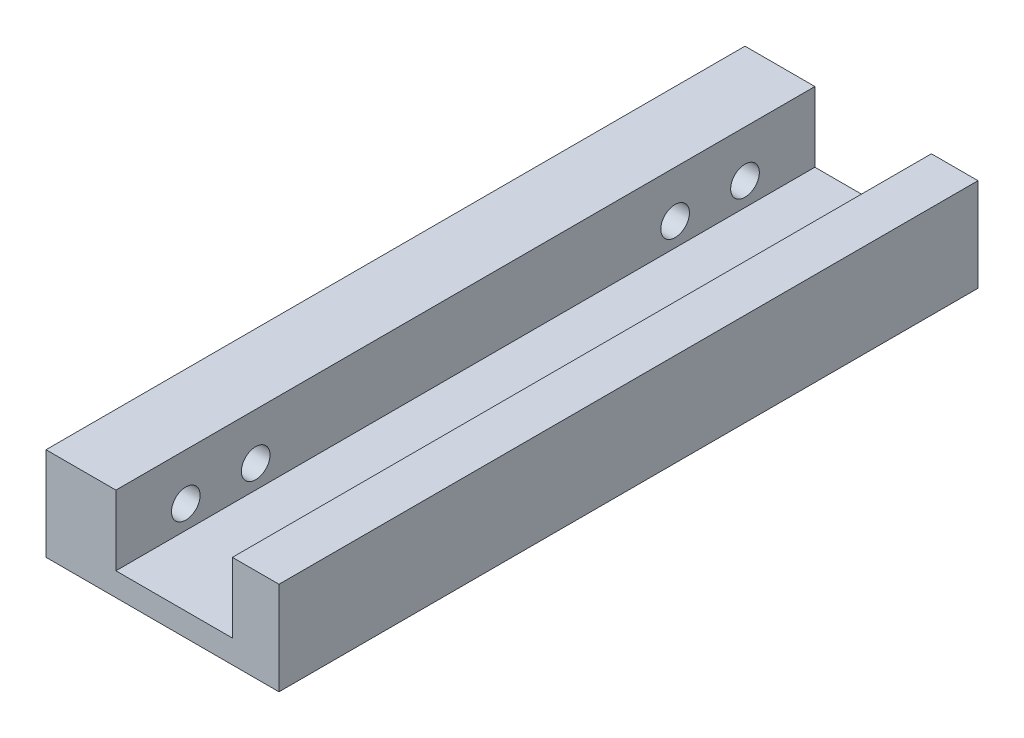
ISO-10303-21;
HEADER;
FILE_DESCRIPTION(('STEP AP214'),'2;1');
FILE_NAME('part.step','',(''),(''),'','','');
FILE_SCHEMA(('AUTOMOTIVE_DESIGN { 1 0 10303 214 1 1 1 1 }'));
ENDSEC;
DATA;
#1=APPLICATION_CONTEXT('core data for automotive mechanical design processes');
#2=APPLICATION_PROTOCOL_DEFINITION('international standard','automotive_design',2000,#1);
#3=PRODUCT_CONTEXT('',#1,'mechanical');
#4=PRODUCT('Part','Part','',(#3));
#5=PRODUCT_RELATED_PRODUCT_CATEGORY('part','',(#4));
#6=PRODUCT_DEFINITION_FORMATION('','',#4);
#7=PRODUCT_DEFINITION_CONTEXT('part definition',#1,'design');
#8=PRODUCT_DEFINITION('design','',#6,#7);
#9=PRODUCT_DEFINITION_SHAPE('','',#8);
#10=(LENGTH_UNIT() NAMED_UNIT(*) SI_UNIT(.MILLI.,.METRE.));
#11=(NAMED_UNIT(*) PLANE_ANGLE_UNIT() SI_UNIT($,.RADIAN.));
#12=(NAMED_UNIT(*) SI_UNIT($,.STERADIAN.) SOLID_ANGLE_UNIT());
#13=UNCERTAINTY_MEASURE_WITH_UNIT(LENGTH_MEASURE(1.E-05),#10,'distance_accuracy_value','');
#14=(GEOMETRIC_REPRESENTATION_CONTEXT(3) GLOBAL_UNCERTAINTY_ASSIGNED_CONTEXT((#13)) GLOBAL_UNIT_ASSIGNED_CONTEXT((#10,
#11,#12)) REPRESENTATION_CONTEXT('',''));
#15=CARTESIAN_POINT('',(0.,0.,0.));
#16=DIRECTION('',(0.,0.,1.));
#17=DIRECTION('',(1.,0.,0.));
#18=AXIS2_PLACEMENT_3D('',#15,#16,#17);
#19=CARTESIAN_POINT('',(0.,-4.,30.));
#20=DIRECTION('',(1.,0.,0.));
#21=DIRECTION('',(0.,0.,-1.));
#22=AXIS2_PLACEMENT_3D('',#19,#20,#21);
#23=PLANE('',#22);
#24=CARTESIAN_POINT('',(0.,-2.,27.));
#25=DIRECTION('',(-1.,0.,0.));
#26=DIRECTION('',(0.,0.,1.));
#27=AXIS2_PLACEMENT_3D('',#24,#25,#26);
#28=CIRCLE('',#27,0.615000000000002);
#29=CARTESIAN_POINT('',(0.,-2.,27.615));
#30=VERTEX_POINT('',#29);
#31=EDGE_CURVE('E197',#30,#30,#28,.T.);
#32=ORIENTED_EDGE('',*,*,#31,.F.);
#33=EDGE_LOOP('',(#32));
#34=FACE_BOUND('',#33,.T.);
#35=CARTESIAN_POINT('',(0.,-2.,24.));
#36=DIRECTION('',(-1.,0.,0.));
#37=DIRECTION('',(0.,0.,1.));
#38=AXIS2_PLACEMENT_3D('',#35,#36,#37);
#39=CIRCLE('',#38,0.615000000000002);
#40=CARTESIAN_POINT('',(0.,-2.,24.615));
#41=VERTEX_POINT('',#40);
#42=EDGE_CURVE('E191',#41,#41,#39,.T.);
#43=ORIENTED_EDGE('',*,*,#42,.F.);
#44=EDGE_LOOP('',(#43));
#45=FACE_BOUND('',#44,.T.);
#46=CARTESIAN_POINT('',(0.,-2.,6.));
#47=DIRECTION('',(-1.,0.,0.));
#48=DIRECTION('',(0.,0.,1.));
#49=AXIS2_PLACEMENT_3D('',#46,#47,#48);
#50=CIRCLE('',#49,0.615);
#51=CARTESIAN_POINT('',(0.,-2.,6.615));
#52=VERTEX_POINT('',#51);
#53=EDGE_CURVE('E185',#52,#52,#50,.T.);
#54=ORIENTED_EDGE('',*,*,#53,.F.);
#55=EDGE_LOOP('',(#54));
#56=FACE_BOUND('',#55,.T.);
#57=CARTESIAN_POINT('',(0.,-2.,3.));
#58=DIRECTION('',(-1.,0.,0.));
#59=DIRECTION('',(0.,0.,1.));
#60=AXIS2_PLACEMENT_3D('',#57,#58,#59);
#61=CIRCLE('',#60,0.615);
#62=CARTESIAN_POINT('',(0.,-2.,3.615));
#63=VERTEX_POINT('',#62);
#64=EDGE_CURVE('E179',#63,#63,#61,.T.);
#65=ORIENTED_EDGE('',*,*,#64,.F.);
#66=EDGE_LOOP('',(#65));
#67=FACE_BOUND('',#66,.T.);
#68=DIRECTION('',(0.,-1.,0.));
#69=VECTOR('',#68,1.);
#70=CARTESIAN_POINT('',(0.,-4.,0.));
#71=LINE('',#70,#69);
#72=CARTESIAN_POINT('',(0.,0.,0.));
#73=VERTEX_POINT('',#72);
#74=CARTESIAN_POINT('',(0.,-4.,0.));
#75=VERTEX_POINT('',#74);
#76=EDGE_CURVE('E129',#73,#75,#71,.T.);
#77=ORIENTED_EDGE('',*,*,#76,.T.);
#78=DIRECTION('',(0.,0.,-1.));
#79=VECTOR('',#78,1.);
#80=CARTESIAN_POINT('',(0.,-4.,30.));
#81=LINE('',#80,#79);
#82=CARTESIAN_POINT('',(0.,-4.,30.));
#83=VERTEX_POINT('',#82);
#84=EDGE_CURVE('E11',#83,#75,#81,.T.);
#85=ORIENTED_EDGE('',*,*,#84,.F.);
#86=DIRECTION('',(0.,-1.,0.));
#87=VECTOR('',#86,1.);
#88=CARTESIAN_POINT('',(0.,-4.,30.));
#89=LINE('',#88,#87);
#90=CARTESIAN_POINT('',(0.,0.,30.));
#91=VERTEX_POINT('',#90);
#92=EDGE_CURVE('E144',#91,#83,#89,.T.);
#93=ORIENTED_EDGE('',*,*,#92,.F.);
#94=DIRECTION('',(0.,0.,-1.));
#95=VECTOR('',#94,1.);
#96=CARTESIAN_POINT('',(0.,0.,30.));
#97=LINE('',#96,#95);
#98=EDGE_CURVE('E125',#91,#73,#97,.T.);
#99=ORIENTED_EDGE('',*,*,#98,.T.);
#100=EDGE_LOOP('',(#77,#85,#93,#99));
#101=FACE_BOUND('',#100,.T.);
#102=ADVANCED_FACE('F33',(#34,#45,#56,#67,#101),#23,.F.);
#103=CARTESIAN_POINT('',(10.,-4.,30.));
#104=DIRECTION('',(0.,1.,0.));
#105=DIRECTION('',(-1.,0.,0.));
#106=AXIS2_PLACEMENT_3D('',#103,#104,#105);
#107=PLANE('',#106);
#108=DIRECTION('',(1.,0.,0.));
#109=VECTOR('',#108,1.);
#110=CARTESIAN_POINT('',(10.,-4.,0.));
#111=LINE('',#110,#109);
#112=CARTESIAN_POINT('',(10.,-4.,0.));
#113=VERTEX_POINT('',#112);
#114=EDGE_CURVE('E132',#75,#113,#111,.T.);
#115=ORIENTED_EDGE('',*,*,#114,.T.);
#116=DIRECTION('',(0.,0.,-1.));
#117=VECTOR('',#116,1.);
#118=CARTESIAN_POINT('',(10.,-4.,30.));
#119=LINE('',#118,#117);
#120=CARTESIAN_POINT('',(10.,-4.,30.));
#121=VERTEX_POINT('',#120);
#122=EDGE_CURVE('E41',#121,#113,#119,.T.);
#123=ORIENTED_EDGE('',*,*,#122,.F.);
#124=DIRECTION('',(1.,0.,0.));
#125=VECTOR('',#124,1.);
#126=CARTESIAN_POINT('',(10.,-4.,30.));
#127=LINE('',#126,#125);
#128=EDGE_CURVE('E92',#83,#121,#127,.T.);
#129=ORIENTED_EDGE('',*,*,#128,.F.);
#130=ORIENTED_EDGE('',*,*,#84,.T.);
#131=EDGE_LOOP('',(#115,#123,#129,#130));
#132=FACE_BOUND('',#131,.T.);
#133=ADVANCED_FACE('F205',(#132),#107,.F.);
#134=CARTESIAN_POINT('',(10.,0.,30.));
#135=DIRECTION('',(-1.,0.,0.));
#136=DIRECTION('',(0.,0.,1.));
#137=AXIS2_PLACEMENT_3D('',#134,#135,#136);
#138=PLANE('',#137);
#139=DIRECTION('',(0.,1.,0.));
#140=VECTOR('',#139,1.);
#141=CARTESIAN_POINT('',(10.,0.,0.));
#142=LINE('',#141,#140);
#143=CARTESIAN_POINT('',(10.,0.,0.));
#144=VERTEX_POINT('',#143);
#145=EDGE_CURVE('E135',#113,#144,#142,.T.);
#146=ORIENTED_EDGE('',*,*,#145,.T.);
#147=DIRECTION('',(0.,0.,-1.));
#148=VECTOR('',#147,1.);
#149=CARTESIAN_POINT('',(10.,0.,30.));
#150=LINE('',#149,#148);
#151=CARTESIAN_POINT('',(10.,0.,30.));
#152=VERTEX_POINT('',#151);
#153=EDGE_CURVE('E151',#152,#144,#150,.T.);
#154=ORIENTED_EDGE('',*,*,#153,.F.);
#155=DIRECTION('',(0.,1.,0.));
#156=VECTOR('',#155,1.);
#157=CARTESIAN_POINT('',(10.,0.,30.));
#158=LINE('',#157,#156);
#159=EDGE_CURVE('E159',#121,#152,#158,.T.);
#160=ORIENTED_EDGE('',*,*,#159,.F.);
#161=ORIENTED_EDGE('',*,*,#122,.T.);
#162=EDGE_LOOP('',(#146,#154,#160,#161));
#163=FACE_BOUND('',#162,.T.);
#164=ADVANCED_FACE('F157',(#163),#138,.F.);
#165=CARTESIAN_POINT('',(8.,0.,30.));
#166=DIRECTION('',(0.,-1.,0.));
#167=DIRECTION('',(0.,0.,-1.));
#168=AXIS2_PLACEMENT_3D('',#165,#166,#167);
#169=PLANE('',#168);
#170=DIRECTION('',(-1.,0.,0.));
#171=VECTOR('',#170,1.);
#172=CARTESIAN_POINT('',(8.,0.,0.));
#173=LINE('',#172,#171);
#174=CARTESIAN_POINT('',(8.,0.,0.));
#175=VERTEX_POINT('',#174);
#176=EDGE_CURVE('E137',#144,#175,#173,.T.);
#177=ORIENTED_EDGE('',*,*,#176,.T.);
#178=DIRECTION('',(0.,0.,-1.));
#179=VECTOR('',#178,1.);
#180=CARTESIAN_POINT('',(8.,0.,30.));
#181=LINE('',#180,#179);
#182=CARTESIAN_POINT('',(8.,0.,30.));
#183=VERTEX_POINT('',#182);
#184=EDGE_CURVE('E148',#183,#175,#181,.T.);
#185=ORIENTED_EDGE('',*,*,#184,.F.);
#186=DIRECTION('',(-1.,0.,0.));
#187=VECTOR('',#186,1.);
#188=CARTESIAN_POINT('',(8.,0.,30.));
#189=LINE('',#188,#187);
#190=EDGE_CURVE('E171',#152,#183,#189,.T.);
#191=ORIENTED_EDGE('',*,*,#190,.F.);
#192=ORIENTED_EDGE('',*,*,#153,.T.);
#193=EDGE_LOOP('',(#177,#185,#191,#192));
#194=FACE_BOUND('',#193,.T.);
#195=ADVANCED_FACE('F167',(#194),#169,.F.);
#196=CARTESIAN_POINT('',(8.,-3.,30.));
#197=DIRECTION('',(1.,0.,0.));
#198=DIRECTION('',(0.,0.,-1.));
#199=AXIS2_PLACEMENT_3D('',#196,#197,#198);
#200=PLANE('',#199);
#201=DIRECTION('',(0.,-1.,0.));
#202=VECTOR('',#201,1.);
#203=CARTESIAN_POINT('',(8.,-3.,0.));
#204=LINE('',#203,#202);
#205=CARTESIAN_POINT('',(8.,-3.,0.));
#206=VERTEX_POINT('',#205);
#207=EDGE_CURVE('E139',#175,#206,#204,.T.);
#208=ORIENTED_EDGE('',*,*,#207,.T.);
#209=DIRECTION('',(0.,0.,-1.));
#210=VECTOR('',#209,1.);
#211=CARTESIAN_POINT('',(8.,-3.,30.));
#212=LINE('',#211,#210);
#213=CARTESIAN_POINT('',(8.,-3.,30.));
#214=VERTEX_POINT('',#213);
#215=EDGE_CURVE('E120',#214,#206,#212,.T.);
#216=ORIENTED_EDGE('',*,*,#215,.F.);
#217=DIRECTION('',(0.,-1.,0.));
#218=VECTOR('',#217,1.);
#219=CARTESIAN_POINT('',(8.,-3.,30.));
#220=LINE('',#219,#218);
#221=EDGE_CURVE('E111',#183,#214,#220,.T.);
#222=ORIENTED_EDGE('',*,*,#221,.F.);
#223=ORIENTED_EDGE('',*,*,#184,.T.);
#224=EDGE_LOOP('',(#208,#216,#222,#223));
#225=FACE_BOUND('',#224,.T.);
#226=ADVANCED_FACE('F170',(#225),#200,.F.);
#227=CARTESIAN_POINT('',(3.,-3.,30.));
#228=DIRECTION('',(0.,-1.,0.));
#229=DIRECTION('',(0.,0.,-1.));
#230=AXIS2_PLACEMENT_3D('',#227,#228,#229);
#231=PLANE('',#230);
#232=DIRECTION('',(-1.,0.,0.));
#233=VECTOR('',#232,1.);
#234=CARTESIAN_POINT('',(3.,-3.,0.));
#235=LINE('',#234,#233);
#236=CARTESIAN_POINT('',(3.,-3.,0.));
#237=VERTEX_POINT('',#236);
#238=EDGE_CURVE('E119',#206,#237,#235,.T.);
#239=ORIENTED_EDGE('',*,*,#238,.T.);
#240=DIRECTION('',(0.,0.,-1.));
#241=VECTOR('',#240,1.);
#242=CARTESIAN_POINT('',(3.,-3.,30.));
#243=LINE('',#242,#241);
#244=CARTESIAN_POINT('',(3.,-3.,30.));
#245=VERTEX_POINT('',#244);
#246=EDGE_CURVE('E116',#245,#237,#243,.T.);
#247=ORIENTED_EDGE('',*,*,#246,.F.);
#248=DIRECTION('',(-1.,0.,0.));
#249=VECTOR('',#248,1.);
#250=CARTESIAN_POINT('',(3.,-3.,30.));
#251=LINE('',#250,#249);
#252=EDGE_CURVE('E105',#214,#245,#251,.T.);
#253=ORIENTED_EDGE('',*,*,#252,.F.);
#254=ORIENTED_EDGE('',*,*,#215,.T.);
#255=EDGE_LOOP('',(#239,#247,#253,#254));
#256=FACE_BOUND('',#255,.T.);
#257=ADVANCED_FACE('F117',(#256),#231,.F.);
#258=CARTESIAN_POINT('',(3.,0.,30.));
#259=DIRECTION('',(-1.,0.,0.));
#260=DIRECTION('',(0.,-1.,0.));
#261=AXIS2_PLACEMENT_3D('',#258,#259,#260);
#262=PLANE('',#261);
#263=CARTESIAN_POINT('',(3.,-2.,27.));
#264=DIRECTION('',(-1.,0.,0.));
#265=DIRECTION('',(0.,-1.,0.));
#266=AXIS2_PLACEMENT_3D('',#263,#264,#265);
#267=CIRCLE('',#266,0.615000000000002);
#268=CARTESIAN_POINT('',(3.,-2.615,27.));
#269=VERTEX_POINT('',#268);
#270=EDGE_CURVE('E194',#269,#269,#267,.F.);
#271=ORIENTED_EDGE('',*,*,#270,.F.);
#272=EDGE_LOOP('',(#271));
#273=FACE_BOUND('',#272,.T.);
#274=CARTESIAN_POINT('',(3.,-2.,24.));
#275=DIRECTION('',(-1.,0.,0.));
#276=DIRECTION('',(0.,-1.,0.));
#277=AXIS2_PLACEMENT_3D('',#274,#275,#276);
#278=CIRCLE('',#277,0.615000000000002);
#279=CARTESIAN_POINT('',(3.,-2.615,24.));
#280=VERTEX_POINT('',#279);
#281=EDGE_CURVE('E188',#280,#280,#278,.F.);
#282=ORIENTED_EDGE('',*,*,#281,.F.);
#283=EDGE_LOOP('',(#282));
#284=FACE_BOUND('',#283,.T.);
#285=CARTESIAN_POINT('',(3.,-2.,6.));
#286=DIRECTION('',(-1.,0.,0.));
#287=DIRECTION('',(0.,-1.,0.));
#288=AXIS2_PLACEMENT_3D('',#285,#286,#287);
#289=CIRCLE('',#288,0.615);
#290=CARTESIAN_POINT('',(3.,-2.615,6.));
#291=VERTEX_POINT('',#290);
#292=EDGE_CURVE('E182',#291,#291,#289,.F.);
#293=ORIENTED_EDGE('',*,*,#292,.F.);
#294=EDGE_LOOP('',(#293));
#295=FACE_BOUND('',#294,.T.);
#296=CARTESIAN_POINT('',(3.,-2.,3.));
#297=DIRECTION('',(-1.,0.,0.));
#298=DIRECTION('',(0.,-1.,0.));
#299=AXIS2_PLACEMENT_3D('',#296,#297,#298);
#300=CIRCLE('',#299,0.615);
#301=CARTESIAN_POINT('',(3.,-2.615,3.));
#302=VERTEX_POINT('',#301);
#303=EDGE_CURVE('E133',#302,#302,#300,.F.);
#304=ORIENTED_EDGE('',*,*,#303,.F.);
#305=EDGE_LOOP('',(#304));
#306=FACE_BOUND('',#305,.T.);
#307=DIRECTION('',(0.,1.,0.));
#308=VECTOR('',#307,1.);
#309=CARTESIAN_POINT('',(3.,0.,0.));
#310=LINE('',#309,#308);
#311=CARTESIAN_POINT('',(3.,0.,0.));
#312=VERTEX_POINT('',#311);
#313=EDGE_CURVE('E78',#237,#312,#310,.T.);
#314=ORIENTED_EDGE('',*,*,#313,.T.);
#315=DIRECTION('',(0.,0.,-1.));
#316=VECTOR('',#315,1.);
#317=CARTESIAN_POINT('',(3.,0.,30.));
#318=LINE('',#317,#316);
#319=CARTESIAN_POINT('',(3.,0.,30.));
#320=VERTEX_POINT('',#319);
#321=EDGE_CURVE('E121',#320,#312,#318,.T.);
#322=ORIENTED_EDGE('',*,*,#321,.F.);
#323=DIRECTION('',(0.,1.,0.));
#324=VECTOR('',#323,1.);
#325=CARTESIAN_POINT('',(3.,0.,30.));
#326=LINE('',#325,#324);
#327=EDGE_CURVE('E109',#245,#320,#326,.T.);
#328=ORIENTED_EDGE('',*,*,#327,.F.);
#329=ORIENTED_EDGE('',*,*,#246,.T.);
#330=EDGE_LOOP('',(#314,#322,#328,#329));
#331=FACE_BOUND('',#330,.T.);
#332=ADVANCED_FACE('F123',(#273,#284,#295,#306,#331),#262,.F.);
#333=CARTESIAN_POINT('',(0.,0.,30.));
#334=DIRECTION('',(0.,-1.,0.));
#335=DIRECTION('',(0.,0.,-1.));
#336=AXIS2_PLACEMENT_3D('',#333,#334,#335);
#337=PLANE('',#336);
#338=DIRECTION('',(-1.,0.,0.));
#339=VECTOR('',#338,1.);
#340=CARTESIAN_POINT('',(0.,0.,0.));
#341=LINE('',#340,#339);
#342=EDGE_CURVE('E84',#312,#73,#341,.T.);
#343=ORIENTED_EDGE('',*,*,#342,.T.);
#344=ORIENTED_EDGE('',*,*,#98,.F.);
#345=DIRECTION('',(-1.,0.,0.));
#346=VECTOR('',#345,1.);
#347=CARTESIAN_POINT('',(0.,0.,30.));
#348=LINE('',#347,#346);
#349=EDGE_CURVE('E49',#320,#91,#348,.T.);
#350=ORIENTED_EDGE('',*,*,#349,.F.);
#351=ORIENTED_EDGE('',*,*,#321,.T.);
#352=EDGE_LOOP('',(#343,#344,#350,#351));
#353=FACE_BOUND('',#352,.T.);
#354=ADVANCED_FACE('F214',(#353),#337,.F.);
#355=CARTESIAN_POINT('',(0.,0.,30.));
#356=DIRECTION('',(0.,0.,-1.));
#357=DIRECTION('',(-1.,0.,0.));
#358=AXIS2_PLACEMENT_3D('',#355,#356,#357);
#359=PLANE('',#358);
#360=ORIENTED_EDGE('',*,*,#92,.T.);
#361=ORIENTED_EDGE('',*,*,#128,.T.);
#362=ORIENTED_EDGE('',*,*,#159,.T.);
#363=ORIENTED_EDGE('',*,*,#190,.T.);
#364=ORIENTED_EDGE('',*,*,#221,.T.);
#365=ORIENTED_EDGE('',*,*,#252,.T.);
#366=ORIENTED_EDGE('',*,*,#327,.T.);
#367=ORIENTED_EDGE('',*,*,#349,.T.);
#368=EDGE_LOOP('',(#360,#361,#362,#363,#364,#365,#366,#367));
#369=FACE_BOUND('',#368,.T.);
#370=ADVANCED_FACE('F107',(#369),#359,.F.);
#371=CARTESIAN_POINT('',(0.,0.,0.));
#372=DIRECTION('',(0.,0.,-1.));
#373=DIRECTION('',(-1.,0.,0.));
#374=AXIS2_PLACEMENT_3D('',#371,#372,#373);
#375=PLANE('',#374);
#376=ORIENTED_EDGE('',*,*,#76,.F.);
#377=ORIENTED_EDGE('',*,*,#342,.F.);
#378=ORIENTED_EDGE('',*,*,#313,.F.);
#379=ORIENTED_EDGE('',*,*,#238,.F.);
#380=ORIENTED_EDGE('',*,*,#207,.F.);
#381=ORIENTED_EDGE('',*,*,#176,.F.);
#382=ORIENTED_EDGE('',*,*,#145,.F.);
#383=ORIENTED_EDGE('',*,*,#114,.F.);
#384=EDGE_LOOP('',(#376,#377,#378,#379,#380,#381,#382,#383));
#385=FACE_BOUND('',#384,.T.);
#386=ADVANCED_FACE('F163',(#385),#375,.T.);
#387=CARTESIAN_POINT('',(4.73948268171891,-2.,3.));
#388=DIRECTION('',(-1.,0.,0.));
#389=DIRECTION('',(0.,0.,1.));
#390=AXIS2_PLACEMENT_3D('',#387,#388,#389);
#391=CYLINDRICAL_SURFACE('',#390,0.615);
#392=ORIENTED_EDGE('',*,*,#303,.T.);
#393=EDGE_LOOP('',(#392));
#394=FACE_BOUND('',#393,.T.);
#395=ORIENTED_EDGE('',*,*,#64,.T.);
#396=EDGE_LOOP('',(#395));
#397=FACE_BOUND('',#396,.T.);
#398=ADVANCED_FACE('F267',(#394,#397),#391,.F.);
#399=CARTESIAN_POINT('',(4.73948268171891,-2.,6.));
#400=DIRECTION('',(-1.,0.,0.));
#401=DIRECTION('',(0.,0.,1.));
#402=AXIS2_PLACEMENT_3D('',#399,#400,#401);
#403=CYLINDRICAL_SURFACE('',#402,0.615);
#404=ORIENTED_EDGE('',*,*,#292,.T.);
#405=EDGE_LOOP('',(#404));
#406=FACE_BOUND('',#405,.T.);
#407=ORIENTED_EDGE('',*,*,#53,.T.);
#408=EDGE_LOOP('',(#407));
#409=FACE_BOUND('',#408,.T.);
#410=ADVANCED_FACE('F272',(#406,#409),#403,.F.);
#411=CARTESIAN_POINT('',(4.73948268171891,-2.,24.));
#412=DIRECTION('',(-1.,0.,0.));
#413=DIRECTION('',(0.,0.,1.));
#414=AXIS2_PLACEMENT_3D('',#411,#412,#413);
#415=CYLINDRICAL_SURFACE('',#414,0.615000000000002);
#416=ORIENTED_EDGE('',*,*,#281,.T.);
#417=EDGE_LOOP('',(#416));
#418=FACE_BOUND('',#417,.T.);
#419=ORIENTED_EDGE('',*,*,#42,.T.);
#420=EDGE_LOOP('',(#419));
#421=FACE_BOUND('',#420,.T.);
#422=ADVANCED_FACE('F284',(#418,#421),#415,.F.);
#423=CARTESIAN_POINT('',(4.73948268171891,-2.,27.));
#424=DIRECTION('',(-1.,0.,0.));
#425=DIRECTION('',(0.,0.,1.));
#426=AXIS2_PLACEMENT_3D('',#423,#424,#425);
#427=CYLINDRICAL_SURFACE('',#426,0.615000000000002);
#428=ORIENTED_EDGE('',*,*,#270,.T.);
#429=EDGE_LOOP('',(#428));
#430=FACE_BOUND('',#429,.T.);
#431=ORIENTED_EDGE('',*,*,#31,.T.);
#432=EDGE_LOOP('',(#431));
#433=FACE_BOUND('',#432,.T.);
#434=ADVANCED_FACE('F201',(#430,#433),#427,.F.);
#435=CLOSED_SHELL('',(#102,#133,#164,#195,#226,#257,#332,#354,#370,#386,#398,#410,#422,#434));
#436=MANIFOLD_SOLID_BREP('B2',#435);
#437=ADVANCED_BREP_SHAPE_REPRESENTATION('',(#18,#436),#14);
#438=SHAPE_DEFINITION_REPRESENTATION(#9,#437);
ENDSEC;
END-ISO-10303-21;
